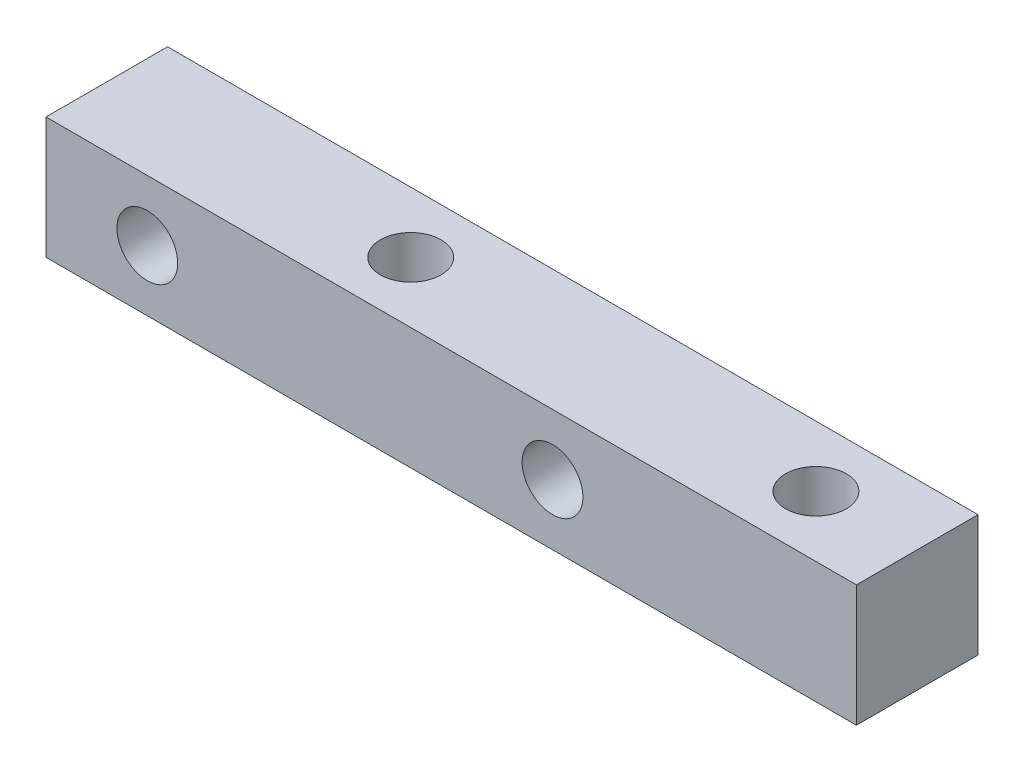
ISO-10303-21;
HEADER;
FILE_DESCRIPTION(('STEP AP214'),'2;1');
FILE_NAME('part.step','',(''),(''),'','','');
FILE_SCHEMA(('AUTOMOTIVE_DESIGN { 1 0 10303 214 1 1 1 1 }'));
ENDSEC;
DATA;
#1=APPLICATION_CONTEXT('core data for automotive mechanical design processes');
#2=APPLICATION_PROTOCOL_DEFINITION('international standard','automotive_design',2000,#1);
#3=PRODUCT_CONTEXT('',#1,'mechanical');
#4=PRODUCT('Part','Part','',(#3));
#5=PRODUCT_RELATED_PRODUCT_CATEGORY('part','',(#4));
#6=PRODUCT_DEFINITION_FORMATION('','',#4);
#7=PRODUCT_DEFINITION_CONTEXT('part definition',#1,'design');
#8=PRODUCT_DEFINITION('design','',#6,#7);
#9=PRODUCT_DEFINITION_SHAPE('','',#8);
#10=(LENGTH_UNIT() NAMED_UNIT(*) SI_UNIT(.MILLI.,.METRE.));
#11=(NAMED_UNIT(*) PLANE_ANGLE_UNIT() SI_UNIT($,.RADIAN.));
#12=(NAMED_UNIT(*) SI_UNIT($,.STERADIAN.) SOLID_ANGLE_UNIT());
#13=UNCERTAINTY_MEASURE_WITH_UNIT(LENGTH_MEASURE(1.E-05),#10,'distance_accuracy_value','');
#14=(GEOMETRIC_REPRESENTATION_CONTEXT(3) GLOBAL_UNCERTAINTY_ASSIGNED_CONTEXT((#13)) GLOBAL_UNIT_ASSIGNED_CONTEXT((#10,
#11,#12)) REPRESENTATION_CONTEXT('',''));
#15=CARTESIAN_POINT('',(0.,0.,0.));
#16=DIRECTION('',(0.,0.,1.));
#17=DIRECTION('',(1.,0.,0.));
#18=AXIS2_PLACEMENT_3D('',#15,#16,#17);
#19=CARTESIAN_POINT('',(20.,3.,6.));
#20=DIRECTION('',(-1.,0.,0.));
#21=DIRECTION('',(0.,0.,1.));
#22=AXIS2_PLACEMENT_3D('',#19,#20,#21);
#23=PLANE('',#22);
#24=DIRECTION('',(0.,1.,0.));
#25=VECTOR('',#24,1.);
#26=CARTESIAN_POINT('',(20.,3.,0.));
#27=LINE('',#26,#25);
#28=CARTESIAN_POINT('',(20.,-3.,0.));
#29=VERTEX_POINT('',#28);
#30=CARTESIAN_POINT('',(20.,3.,0.));
#31=VERTEX_POINT('',#30);
#32=EDGE_CURVE('E107',#29,#31,#27,.T.);
#33=ORIENTED_EDGE('',*,*,#32,.T.);
#34=DIRECTION('',(0.,0.,-1.));
#35=VECTOR('',#34,1.);
#36=CARTESIAN_POINT('',(20.,3.,6.));
#37=LINE('',#36,#35);
#38=CARTESIAN_POINT('',(20.,3.,6.));
#39=VERTEX_POINT('',#38);
#40=EDGE_CURVE('E11',#39,#31,#37,.T.);
#41=ORIENTED_EDGE('',*,*,#40,.F.);
#42=DIRECTION('',(0.,1.,0.));
#43=VECTOR('',#42,1.);
#44=CARTESIAN_POINT('',(20.,3.,6.));
#45=LINE('',#44,#43);
#46=CARTESIAN_POINT('',(20.,-3.,6.));
#47=VERTEX_POINT('',#46);
#48=EDGE_CURVE('E91',#47,#39,#45,.T.);
#49=ORIENTED_EDGE('',*,*,#48,.F.);
#50=DIRECTION('',(0.,0.,-1.));
#51=VECTOR('',#50,1.);
#52=CARTESIAN_POINT('',(20.,-3.,6.));
#53=LINE('',#52,#51);
#54=EDGE_CURVE('E103',#47,#29,#53,.T.);
#55=ORIENTED_EDGE('',*,*,#54,.T.);
#56=EDGE_LOOP('',(#33,#41,#49,#55));
#57=FACE_BOUND('',#56,.T.);
#58=ADVANCED_FACE('F39',(#57),#23,.F.);
#59=CARTESIAN_POINT('',(-20.,3.,6.));
#60=DIRECTION('',(0.,-1.,0.));
#61=DIRECTION('',(0.,0.,-1.));
#62=AXIS2_PLACEMENT_3D('',#59,#60,#61);
#63=PLANE('',#62);
#64=CARTESIAN_POINT('',(15.,3.,3.));
#65=DIRECTION('',(0.,1.,0.));
#66=DIRECTION('',(0.,0.,1.));
#67=AXIS2_PLACEMENT_3D('',#64,#65,#66);
#68=CIRCLE('',#67,1.5);
#69=CARTESIAN_POINT('',(15.,3.,4.50000000000001));
#70=VERTEX_POINT('',#69);
#71=EDGE_CURVE('E152',#70,#70,#68,.T.);
#72=ORIENTED_EDGE('',*,*,#71,.F.);
#73=EDGE_LOOP('',(#72));
#74=FACE_BOUND('',#73,.T.);
#75=CARTESIAN_POINT('',(-5.,3.,3.));
#76=DIRECTION('',(0.,1.,0.));
#77=DIRECTION('',(0.,0.,1.));
#78=AXIS2_PLACEMENT_3D('',#75,#76,#77);
#79=CIRCLE('',#78,1.5);
#80=CARTESIAN_POINT('',(-5.,3.,4.5));
#81=VERTEX_POINT('',#80);
#82=EDGE_CURVE('E144',#81,#81,#79,.T.);
#83=ORIENTED_EDGE('',*,*,#82,.F.);
#84=EDGE_LOOP('',(#83));
#85=FACE_BOUND('',#84,.T.);
#86=DIRECTION('',(-1.,0.,0.));
#87=VECTOR('',#86,1.);
#88=CARTESIAN_POINT('',(-20.,3.,0.));
#89=LINE('',#88,#87);
#90=CARTESIAN_POINT('',(-20.,3.,0.));
#91=VERTEX_POINT('',#90);
#92=EDGE_CURVE('E96',#31,#91,#89,.T.);
#93=ORIENTED_EDGE('',*,*,#92,.T.);
#94=DIRECTION('',(0.,0.,-1.));
#95=VECTOR('',#94,1.);
#96=CARTESIAN_POINT('',(-20.,3.,6.));
#97=LINE('',#96,#95);
#98=CARTESIAN_POINT('',(-20.,3.,6.));
#99=VERTEX_POINT('',#98);
#100=EDGE_CURVE('E48',#99,#91,#97,.T.);
#101=ORIENTED_EDGE('',*,*,#100,.F.);
#102=DIRECTION('',(-1.,0.,0.));
#103=VECTOR('',#102,1.);
#104=CARTESIAN_POINT('',(-20.,3.,6.));
#105=LINE('',#104,#103);
#106=EDGE_CURVE('E86',#39,#99,#105,.T.);
#107=ORIENTED_EDGE('',*,*,#106,.F.);
#108=ORIENTED_EDGE('',*,*,#40,.T.);
#109=EDGE_LOOP('',(#93,#101,#107,#108));
#110=FACE_BOUND('',#109,.T.);
#111=ADVANCED_FACE('F95',(#74,#85,#110),#63,.F.);
#112=CARTESIAN_POINT('',(-20.,3.,6.));
#113=DIRECTION('',(1.,0.,0.));
#114=DIRECTION('',(0.,0.,-1.));
#115=AXIS2_PLACEMENT_3D('',#112,#113,#114);
#116=PLANE('',#115);
#117=DIRECTION('',(0.,-1.,0.));
#118=VECTOR('',#117,1.);
#119=CARTESIAN_POINT('',(-20.,3.,0.));
#120=LINE('',#119,#118);
#121=CARTESIAN_POINT('',(-20.,-3.,0.));
#122=VERTEX_POINT('',#121);
#123=EDGE_CURVE('E73',#91,#122,#120,.T.);
#124=ORIENTED_EDGE('',*,*,#123,.T.);
#125=DIRECTION('',(0.,0.,-1.));
#126=VECTOR('',#125,1.);
#127=CARTESIAN_POINT('',(-20.,-3.,6.));
#128=LINE('',#127,#126);
#129=CARTESIAN_POINT('',(-20.,-3.,6.));
#130=VERTEX_POINT('',#129);
#131=EDGE_CURVE('E98',#130,#122,#128,.T.);
#132=ORIENTED_EDGE('',*,*,#131,.F.);
#133=DIRECTION('',(0.,-1.,0.));
#134=VECTOR('',#133,1.);
#135=CARTESIAN_POINT('',(-20.,3.,6.));
#136=LINE('',#135,#134);
#137=EDGE_CURVE('E89',#99,#130,#136,.T.);
#138=ORIENTED_EDGE('',*,*,#137,.F.);
#139=ORIENTED_EDGE('',*,*,#100,.T.);
#140=EDGE_LOOP('',(#124,#132,#138,#139));
#141=FACE_BOUND('',#140,.T.);
#142=ADVANCED_FACE('F99',(#141),#116,.F.);
#143=CARTESIAN_POINT('',(-20.,-3.,6.));
#144=DIRECTION('',(0.,1.,0.));
#145=DIRECTION('',(0.,0.,1.));
#146=AXIS2_PLACEMENT_3D('',#143,#144,#145);
#147=PLANE('',#146);
#148=CARTESIAN_POINT('',(15.,-3.,3.));
#149=DIRECTION('',(0.,1.,0.));
#150=DIRECTION('',(0.,0.,1.));
#151=AXIS2_PLACEMENT_3D('',#148,#149,#150);
#152=CIRCLE('',#151,1.5);
#153=CARTESIAN_POINT('',(15.,-3.,4.50000000000001));
#154=VERTEX_POINT('',#153);
#155=EDGE_CURVE('E133',#154,#154,#152,.T.);
#156=ORIENTED_EDGE('',*,*,#155,.T.);
#157=EDGE_LOOP('',(#156));
#158=FACE_BOUND('',#157,.T.);
#159=CARTESIAN_POINT('',(-5.,-3.,3.));
#160=DIRECTION('',(0.,1.,0.));
#161=DIRECTION('',(0.,0.,1.));
#162=AXIS2_PLACEMENT_3D('',#159,#160,#161);
#163=CIRCLE('',#162,1.5);
#164=CARTESIAN_POINT('',(-5.,-3.,4.5));
#165=VERTEX_POINT('',#164);
#166=EDGE_CURVE('E148',#165,#165,#163,.T.);
#167=ORIENTED_EDGE('',*,*,#166,.T.);
#168=EDGE_LOOP('',(#167));
#169=FACE_BOUND('',#168,.T.);
#170=DIRECTION('',(1.,0.,0.));
#171=VECTOR('',#170,1.);
#172=CARTESIAN_POINT('',(-20.,-3.,0.));
#173=LINE('',#172,#171);
#174=EDGE_CURVE('E79',#122,#29,#173,.T.);
#175=ORIENTED_EDGE('',*,*,#174,.T.);
#176=ORIENTED_EDGE('',*,*,#54,.F.);
#177=DIRECTION('',(1.,0.,0.));
#178=VECTOR('',#177,1.);
#179=CARTESIAN_POINT('',(-20.,-3.,6.));
#180=LINE('',#179,#178);
#181=EDGE_CURVE('E56',#130,#47,#180,.T.);
#182=ORIENTED_EDGE('',*,*,#181,.F.);
#183=ORIENTED_EDGE('',*,*,#131,.T.);
#184=EDGE_LOOP('',(#175,#176,#182,#183));
#185=FACE_BOUND('',#184,.T.);
#186=ADVANCED_FACE('F121',(#158,#169,#185),#147,.F.);
#187=CARTESIAN_POINT('',(0.,0.,6.));
#188=DIRECTION('',(0.,0.,1.));
#189=DIRECTION('',(1.,0.,0.));
#190=AXIS2_PLACEMENT_3D('',#187,#188,#189);
#191=PLANE('',#190);
#192=CARTESIAN_POINT('',(-15.,0.,6.));
#193=DIRECTION('',(0.,0.,1.));
#194=DIRECTION('',(1.,0.,0.));
#195=AXIS2_PLACEMENT_3D('',#192,#193,#194);
#196=CIRCLE('',#195,1.5);
#197=CARTESIAN_POINT('',(-13.5,0.,6.));
#198=VERTEX_POINT('',#197);
#199=EDGE_CURVE('E137',#198,#198,#196,.T.);
#200=ORIENTED_EDGE('',*,*,#199,.F.);
#201=EDGE_LOOP('',(#200));
#202=FACE_BOUND('',#201,.T.);
#203=CARTESIAN_POINT('',(5.,0.,6.));
#204=DIRECTION('',(0.,0.,1.));
#205=DIRECTION('',(1.,0.,0.));
#206=AXIS2_PLACEMENT_3D('',#203,#204,#205);
#207=CIRCLE('',#206,1.5);
#208=CARTESIAN_POINT('',(6.5,0.,6.));
#209=VERTEX_POINT('',#208);
#210=EDGE_CURVE('E128',#209,#209,#207,.T.);
#211=ORIENTED_EDGE('',*,*,#210,.F.);
#212=EDGE_LOOP('',(#211));
#213=FACE_BOUND('',#212,.T.);
#214=ORIENTED_EDGE('',*,*,#48,.T.);
#215=ORIENTED_EDGE('',*,*,#106,.T.);
#216=ORIENTED_EDGE('',*,*,#137,.T.);
#217=ORIENTED_EDGE('',*,*,#181,.T.);
#218=EDGE_LOOP('',(#214,#215,#216,#217));
#219=FACE_BOUND('',#218,.T.);
#220=ADVANCED_FACE('F87',(#202,#213,#219),#191,.T.);
#221=CARTESIAN_POINT('',(0.,0.,0.));
#222=DIRECTION('',(0.,0.,1.));
#223=DIRECTION('',(1.,0.,0.));
#224=AXIS2_PLACEMENT_3D('',#221,#222,#223);
#225=PLANE('',#224);
#226=CARTESIAN_POINT('',(-15.,0.,0.));
#227=DIRECTION('',(0.,0.,1.));
#228=DIRECTION('',(1.,0.,0.));
#229=AXIS2_PLACEMENT_3D('',#226,#227,#228);
#230=CIRCLE('',#229,1.5);
#231=CARTESIAN_POINT('',(-13.5,0.,0.));
#232=VERTEX_POINT('',#231);
#233=EDGE_CURVE('E111',#232,#232,#230,.T.);
#234=ORIENTED_EDGE('',*,*,#233,.T.);
#235=EDGE_LOOP('',(#234));
#236=FACE_BOUND('',#235,.T.);
#237=CARTESIAN_POINT('',(5.,0.,0.));
#238=DIRECTION('',(0.,0.,1.));
#239=DIRECTION('',(1.,0.,0.));
#240=AXIS2_PLACEMENT_3D('',#237,#238,#239);
#241=CIRCLE('',#240,1.5);
#242=CARTESIAN_POINT('',(6.5,0.,0.));
#243=VERTEX_POINT('',#242);
#244=EDGE_CURVE('E132',#243,#243,#241,.T.);
#245=ORIENTED_EDGE('',*,*,#244,.T.);
#246=EDGE_LOOP('',(#245));
#247=FACE_BOUND('',#246,.T.);
#248=ORIENTED_EDGE('',*,*,#32,.F.);
#249=ORIENTED_EDGE('',*,*,#174,.F.);
#250=ORIENTED_EDGE('',*,*,#123,.F.);
#251=ORIENTED_EDGE('',*,*,#92,.F.);
#252=EDGE_LOOP('',(#248,#249,#250,#251));
#253=FACE_BOUND('',#252,.T.);
#254=ADVANCED_FACE('F124',(#236,#247,#253),#225,.F.);
#255=CARTESIAN_POINT('',(5.,0.,0.));
#256=DIRECTION('',(0.,0.,1.));
#257=DIRECTION('',(1.,0.,0.));
#258=AXIS2_PLACEMENT_3D('',#255,#256,#257);
#259=CYLINDRICAL_SURFACE('',#258,1.5);
#260=ORIENTED_EDGE('',*,*,#244,.F.);
#261=EDGE_LOOP('',(#260));
#262=FACE_BOUND('',#261,.T.);
#263=ORIENTED_EDGE('',*,*,#210,.T.);
#264=EDGE_LOOP('',(#263));
#265=FACE_BOUND('',#264,.T.);
#266=ADVANCED_FACE('F180',(#262,#265),#259,.F.);
#267=CARTESIAN_POINT('',(-15.,0.,0.));
#268=DIRECTION('',(0.,0.,1.));
#269=DIRECTION('',(1.,0.,0.));
#270=AXIS2_PLACEMENT_3D('',#267,#268,#269);
#271=CYLINDRICAL_SURFACE('',#270,1.5);
#272=ORIENTED_EDGE('',*,*,#233,.F.);
#273=EDGE_LOOP('',(#272));
#274=FACE_BOUND('',#273,.T.);
#275=ORIENTED_EDGE('',*,*,#199,.T.);
#276=EDGE_LOOP('',(#275));
#277=FACE_BOUND('',#276,.T.);
#278=ADVANCED_FACE('F174',(#274,#277),#271,.F.);
#279=CARTESIAN_POINT('',(-5.,-3.,3.));
#280=DIRECTION('',(0.,1.,0.));
#281=DIRECTION('',(0.,0.,1.));
#282=AXIS2_PLACEMENT_3D('',#279,#280,#281);
#283=CYLINDRICAL_SURFACE('',#282,1.5);
#284=ORIENTED_EDGE('',*,*,#166,.F.);
#285=EDGE_LOOP('',(#284));
#286=FACE_BOUND('',#285,.T.);
#287=ORIENTED_EDGE('',*,*,#82,.T.);
#288=EDGE_LOOP('',(#287));
#289=FACE_BOUND('',#288,.T.);
#290=ADVANCED_FACE('F165',(#286,#289),#283,.F.);
#291=CARTESIAN_POINT('',(15.,-3.,3.));
#292=DIRECTION('',(0.,1.,0.));
#293=DIRECTION('',(0.,0.,1.));
#294=AXIS2_PLACEMENT_3D('',#291,#292,#293);
#295=CYLINDRICAL_SURFACE('',#294,1.5);
#296=ORIENTED_EDGE('',*,*,#155,.F.);
#297=EDGE_LOOP('',(#296));
#298=FACE_BOUND('',#297,.T.);
#299=ORIENTED_EDGE('',*,*,#71,.T.);
#300=EDGE_LOOP('',(#299));
#301=FACE_BOUND('',#300,.T.);
#302=ADVANCED_FACE('F162',(#298,#301),#295,.F.);
#303=CLOSED_SHELL('',(#58,#111,#142,#186,#220,#254,#266,#278,#290,#302));
#304=MANIFOLD_SOLID_BREP('B2',#303);
#305=ADVANCED_BREP_SHAPE_REPRESENTATION('',(#18,#304),#14);
#306=SHAPE_DEFINITION_REPRESENTATION(#9,#305);
ENDSEC;
END-ISO-10303-21;
